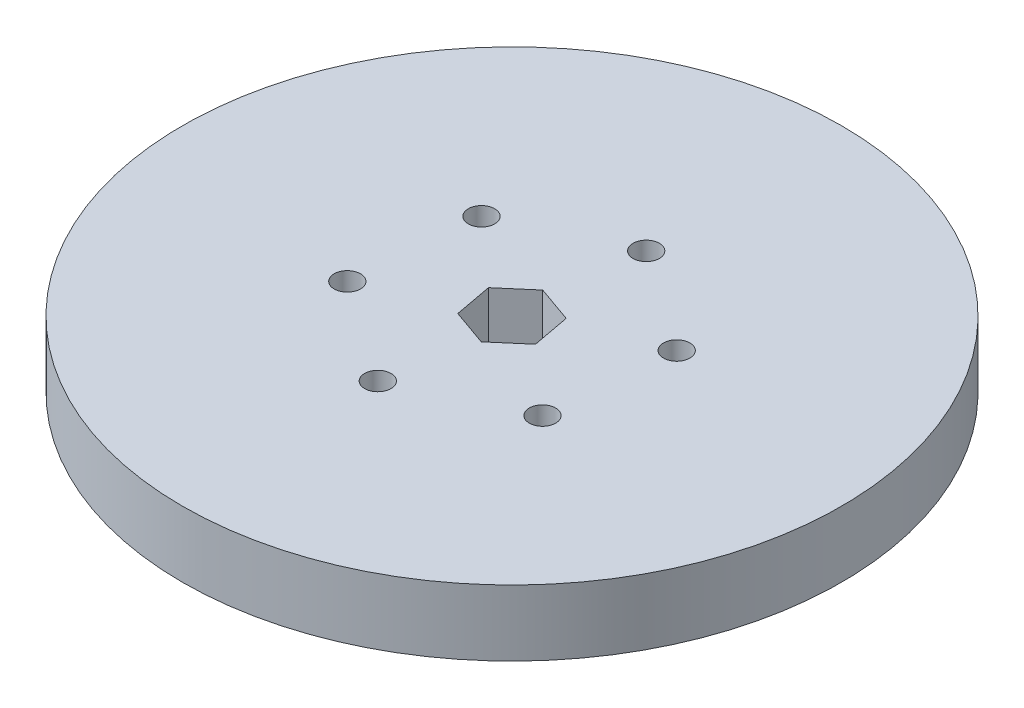
ISO-10303-21;
HEADER;
FILE_DESCRIPTION(('STEP AP214'),'2;1');
FILE_NAME('part.step','',(''),(''),'','','');
FILE_SCHEMA(('AUTOMOTIVE_DESIGN { 1 0 10303 214 1 1 1 1 }'));
ENDSEC;
DATA;
#1=APPLICATION_CONTEXT('core data for automotive mechanical design processes');
#2=APPLICATION_PROTOCOL_DEFINITION('international standard','automotive_design',2000,#1);
#3=PRODUCT_CONTEXT('',#1,'mechanical');
#4=PRODUCT('Part','Part','',(#3));
#5=PRODUCT_RELATED_PRODUCT_CATEGORY('part','',(#4));
#6=PRODUCT_DEFINITION_FORMATION('','',#4);
#7=PRODUCT_DEFINITION_CONTEXT('part definition',#1,'design');
#8=PRODUCT_DEFINITION('design','',#6,#7);
#9=PRODUCT_DEFINITION_SHAPE('','',#8);
#10=(LENGTH_UNIT() NAMED_UNIT(*) SI_UNIT(.MILLI.,.METRE.));
#11=(NAMED_UNIT(*) PLANE_ANGLE_UNIT() SI_UNIT($,.RADIAN.));
#12=(NAMED_UNIT(*) SI_UNIT($,.STERADIAN.) SOLID_ANGLE_UNIT());
#13=UNCERTAINTY_MEASURE_WITH_UNIT(LENGTH_MEASURE(1.E-05),#10,'distance_accuracy_value','');
#14=(GEOMETRIC_REPRESENTATION_CONTEXT(3) GLOBAL_UNCERTAINTY_ASSIGNED_CONTEXT((#13)) GLOBAL_UNIT_ASSIGNED_CONTEXT((#10,
#11,#12)) REPRESENTATION_CONTEXT('',''));
#15=CARTESIAN_POINT('',(0.,0.,0.));
#16=DIRECTION('',(0.,0.,1.));
#17=DIRECTION('',(1.,0.,0.));
#18=AXIS2_PLACEMENT_3D('',#15,#16,#17);
#19=CARTESIAN_POINT('',(0.,-12.7,0.));
#20=DIRECTION('',(0.,1.,0.));
#21=DIRECTION('',(0.,0.,1.));
#22=AXIS2_PLACEMENT_3D('',#19,#20,#21);
#23=CYLINDRICAL_SURFACE('',#22,63.5);
#24=CARTESIAN_POINT('',(0.,-12.7,0.));
#25=DIRECTION('',(0.,1.,0.));
#26=DIRECTION('',(0.,0.,1.));
#27=AXIS2_PLACEMENT_3D('',#24,#25,#26);
#28=CIRCLE('',#27,63.5);
#29=CARTESIAN_POINT('',(0.,-12.7,63.5));
#30=VERTEX_POINT('',#29);
#31=EDGE_CURVE('E11',#30,#30,#28,.T.);
#32=ORIENTED_EDGE('',*,*,#31,.T.);
#33=EDGE_LOOP('',(#32));
#34=FACE_BOUND('',#33,.T.);
#35=CARTESIAN_POINT('',(0.,0.,0.));
#36=DIRECTION('',(0.,1.,0.));
#37=DIRECTION('',(0.,0.,1.));
#38=AXIS2_PLACEMENT_3D('',#35,#36,#37);
#39=CIRCLE('',#38,63.5);
#40=CARTESIAN_POINT('',(0.,0.,63.5));
#41=VERTEX_POINT('',#40);
#42=EDGE_CURVE('E42',#41,#41,#39,.T.);
#43=ORIENTED_EDGE('',*,*,#42,.F.);
#44=EDGE_LOOP('',(#43));
#45=FACE_BOUND('',#44,.T.);
#46=ADVANCED_FACE('F39',(#34,#45),#23,.T.);
#47=CARTESIAN_POINT('',(0.,-12.7,0.));
#48=DIRECTION('',(0.,1.,0.));
#49=DIRECTION('',(0.,0.,1.));
#50=AXIS2_PLACEMENT_3D('',#47,#48,#49);
#51=PLANE('',#50);
#52=DIRECTION('',(-0.759346339530682,0.,0.65068666548605));
#53=VECTOR('',#52,1.);
#54=CARTESIAN_POINT('',(-1.36144400348039,-12.7,-7.27945372666937));
#55=LINE('',#54,#53);
#56=CARTESIAN_POINT('',(-1.36144400348039,-12.7,-7.27945372666937));
#57=VERTEX_POINT('',#56);
#58=CARTESIAN_POINT('',(-6.98491385470918,-12.7,-2.46068177049068));
#59=VERTEX_POINT('',#58);
#60=EDGE_CURVE('E101',#57,#59,#55,.T.);
#61=ORIENTED_EDGE('',*,*,#60,.T.);
#62=DIRECTION('',(0.183838012449366,0.,0.982956553047319));
#63=VECTOR('',#62,1.);
#64=CARTESIAN_POINT('',(-6.98491385470918,-12.7,-2.46068177049068));
#65=LINE('',#64,#63);
#66=CARTESIAN_POINT('',(-5.62346985122879,-12.7,4.81877195617869));
#67=VERTEX_POINT('',#66);
#68=EDGE_CURVE('E94',#59,#67,#65,.T.);
#69=ORIENTED_EDGE('',*,*,#68,.T.);
#70=DIRECTION('',(0.943184351980047,0.,0.332269887561269));
#71=VECTOR('',#70,1.);
#72=CARTESIAN_POINT('',(-5.62346985122879,-12.7,4.81877195617869));
#73=LINE('',#72,#71);
#74=CARTESIAN_POINT('',(1.36144400348039,-12.7,7.27945372666938));
#75=VERTEX_POINT('',#74);
#76=EDGE_CURVE('E104',#67,#75,#73,.T.);
#77=ORIENTED_EDGE('',*,*,#76,.T.);
#78=DIRECTION('',(0.759346339530681,0.,-0.65068666548605));
#79=VECTOR('',#78,1.);
#80=CARTESIAN_POINT('',(1.36144400348039,-12.7,7.27945372666938));
#81=LINE('',#80,#79);
#82=CARTESIAN_POINT('',(6.98491385470918,-12.7,2.46068177049068));
#83=VERTEX_POINT('',#82);
#84=EDGE_CURVE('E54',#75,#83,#81,.T.);
#85=ORIENTED_EDGE('',*,*,#84,.T.);
#86=DIRECTION('',(-0.183838012449366,0.,-0.982956553047319));
#87=VECTOR('',#86,1.);
#88=CARTESIAN_POINT('',(6.98491385470918,-12.7,2.46068177049068));
#89=LINE('',#88,#87);
#90=CARTESIAN_POINT('',(5.62346985122879,-12.7,-4.81877195617869));
#91=VERTEX_POINT('',#90);
#92=EDGE_CURVE('E123',#83,#91,#89,.T.);
#93=ORIENTED_EDGE('',*,*,#92,.T.);
#94=DIRECTION('',(-0.943184351980047,0.,-0.332269887561269));
#95=VECTOR('',#94,1.);
#96=CARTESIAN_POINT('',(5.62346985122879,-12.7,-4.81877195617869));
#97=LINE('',#96,#95);
#98=EDGE_CURVE('E127',#91,#57,#97,.T.);
#99=ORIENTED_EDGE('',*,*,#98,.T.);
#100=EDGE_LOOP('',(#61,#69,#77,#85,#93,#99));
#101=FACE_BOUND('',#100,.T.);
#102=CARTESIAN_POINT('',(-2.0723522882915,-12.7,23.7858935504474));
#103=DIRECTION('',(0.,1.,0.));
#104=DIRECTION('',(0.,0.,1.));
#105=AXIS2_PLACEMENT_3D('',#102,#103,#104);
#106=CIRCLE('',#105,2.54);
#107=CARTESIAN_POINT('',(-2.0723522882915,-12.7,26.3258935504474));
#108=VERTEX_POINT('',#107);
#109=EDGE_CURVE('E196',#108,#108,#106,.T.);
#110=ORIENTED_EDGE('',*,*,#109,.T.);
#111=EDGE_LOOP('',(#110));
#112=FACE_BOUND('',#111,.T.);
#113=CARTESIAN_POINT('',(19.5630119222539,-12.7,13.6876565024752));
#114=DIRECTION('',(0.,1.,0.));
#115=DIRECTION('',(0.,0.,1.));
#116=AXIS2_PLACEMENT_3D('',#113,#114,#115);
#117=CIRCLE('',#116,2.54000000000001);
#118=CARTESIAN_POINT('',(19.5630119222539,-12.7,16.2276565024752));
#119=VERTEX_POINT('',#118);
#120=EDGE_CURVE('E188',#119,#119,#117,.T.);
#121=ORIENTED_EDGE('',*,*,#120,.T.);
#122=EDGE_LOOP('',(#121));
#123=FACE_BOUND('',#122,.T.);
#124=CARTESIAN_POINT('',(-21.6353642105456,-12.7,10.0982370479724));
#125=DIRECTION('',(0.,1.,0.));
#126=DIRECTION('',(0.,0.,1.));
#127=AXIS2_PLACEMENT_3D('',#124,#125,#126);
#128=CIRCLE('',#127,2.54000000000001);
#129=CARTESIAN_POINT('',(-21.6353642105456,-12.7,12.6382370479724));
#130=VERTEX_POINT('',#129);
#131=EDGE_CURVE('E180',#130,#130,#128,.T.);
#132=ORIENTED_EDGE('',*,*,#131,.T.);
#133=EDGE_LOOP('',(#132));
#134=FACE_BOUND('',#133,.T.);
#135=CARTESIAN_POINT('',(-19.563011922254,-12.7,-13.687656502475));
#136=DIRECTION('',(0.,1.,0.));
#137=DIRECTION('',(0.,0.,1.));
#138=AXIS2_PLACEMENT_3D('',#135,#136,#137);
#139=CIRCLE('',#138,2.54);
#140=CARTESIAN_POINT('',(-19.563011922254,-12.7,-11.147656502475));
#141=VERTEX_POINT('',#140);
#142=EDGE_CURVE('E172',#141,#141,#139,.T.);
#143=ORIENTED_EDGE('',*,*,#142,.T.);
#144=EDGE_LOOP('',(#143));
#145=FACE_BOUND('',#144,.T.);
#146=CARTESIAN_POINT('',(2.07235228829167,-12.7,-23.7858935504473));
#147=DIRECTION('',(0.,1.,0.));
#148=DIRECTION('',(0.,0.,1.));
#149=AXIS2_PLACEMENT_3D('',#146,#147,#148);
#150=CIRCLE('',#149,2.54000000000001);
#151=CARTESIAN_POINT('',(2.07235228829167,-12.7,-21.2458935504473));
#152=VERTEX_POINT('',#151);
#153=EDGE_CURVE('E163',#152,#152,#150,.T.);
#154=ORIENTED_EDGE('',*,*,#153,.T.);
#155=EDGE_LOOP('',(#154));
#156=FACE_BOUND('',#155,.T.);
#157=CARTESIAN_POINT('',(21.6353642105457,-12.7,-10.0982370479722));
#158=DIRECTION('',(0.,1.,0.));
#159=DIRECTION('',(0.,0.,1.));
#160=AXIS2_PLACEMENT_3D('',#157,#158,#159);
#161=CIRCLE('',#160,2.54000000000001);
#162=CARTESIAN_POINT('',(21.6353642105457,-12.7,-7.55823704797221));
#163=VERTEX_POINT('',#162);
#164=EDGE_CURVE('E203',#163,#163,#161,.T.);
#165=ORIENTED_EDGE('',*,*,#164,.T.);
#166=EDGE_LOOP('',(#165));
#167=FACE_BOUND('',#166,.T.);
#168=ORIENTED_EDGE('',*,*,#31,.F.);
#169=EDGE_LOOP('',(#168));
#170=FACE_BOUND('',#169,.T.);
#171=ADVANCED_FACE('F109',(#101,#112,#123,#134,#145,#156,#167,#170),#51,.F.);
#172=CARTESIAN_POINT('',(0.,0.,0.));
#173=DIRECTION('',(0.,1.,0.));
#174=DIRECTION('',(0.,0.,1.));
#175=AXIS2_PLACEMENT_3D('',#172,#173,#174);
#176=PLANE('',#175);
#177=DIRECTION('',(0.183838012449366,0.,0.982956553047319));
#178=VECTOR('',#177,1.);
#179=CARTESIAN_POINT('',(-6.98491385470918,0.,-2.46068177049068));
#180=LINE('',#179,#178);
#181=CARTESIAN_POINT('',(-6.98491385470918,0.,-2.46068177049068));
#182=VERTEX_POINT('',#181);
#183=CARTESIAN_POINT('',(-5.62346985122879,0.,4.81877195617869));
#184=VERTEX_POINT('',#183);
#185=EDGE_CURVE('E62',#182,#184,#180,.T.);
#186=ORIENTED_EDGE('',*,*,#185,.F.);
#187=DIRECTION('',(-0.759346339530682,0.,0.65068666548605));
#188=VECTOR('',#187,1.);
#189=CARTESIAN_POINT('',(-1.36144400348039,0.,-7.27945372666937));
#190=LINE('',#189,#188);
#191=CARTESIAN_POINT('',(-1.36144400348039,0.,-7.27945372666937));
#192=VERTEX_POINT('',#191);
#193=EDGE_CURVE('E114',#192,#182,#190,.T.);
#194=ORIENTED_EDGE('',*,*,#193,.F.);
#195=DIRECTION('',(-0.943184351980047,0.,-0.332269887561269));
#196=VECTOR('',#195,1.);
#197=CARTESIAN_POINT('',(5.62346985122879,0.,-4.81877195617869));
#198=LINE('',#197,#196);
#199=CARTESIAN_POINT('',(5.62346985122879,0.,-4.81877195617869));
#200=VERTEX_POINT('',#199);
#201=EDGE_CURVE('E118',#200,#192,#198,.T.);
#202=ORIENTED_EDGE('',*,*,#201,.F.);
#203=DIRECTION('',(-0.183838012449366,0.,-0.982956553047319));
#204=VECTOR('',#203,1.);
#205=CARTESIAN_POINT('',(6.98491385470918,0.,2.46068177049068));
#206=LINE('',#205,#204);
#207=CARTESIAN_POINT('',(6.98491385470918,0.,2.46068177049068));
#208=VERTEX_POINT('',#207);
#209=EDGE_CURVE('E141',#208,#200,#206,.T.);
#210=ORIENTED_EDGE('',*,*,#209,.F.);
#211=DIRECTION('',(0.759346339530681,0.,-0.65068666548605));
#212=VECTOR('',#211,1.);
#213=CARTESIAN_POINT('',(1.36144400348039,0.,7.27945372666938));
#214=LINE('',#213,#212);
#215=CARTESIAN_POINT('',(1.36144400348039,0.,7.27945372666938));
#216=VERTEX_POINT('',#215);
#217=EDGE_CURVE('E137',#216,#208,#214,.T.);
#218=ORIENTED_EDGE('',*,*,#217,.F.);
#219=DIRECTION('',(0.943184351980047,0.,0.332269887561269));
#220=VECTOR('',#219,1.);
#221=CARTESIAN_POINT('',(-5.62346985122879,0.,4.81877195617869));
#222=LINE('',#221,#220);
#223=EDGE_CURVE('E134',#184,#216,#222,.T.);
#224=ORIENTED_EDGE('',*,*,#223,.F.);
#225=EDGE_LOOP('',(#186,#194,#202,#210,#218,#224));
#226=FACE_BOUND('',#225,.T.);
#227=CARTESIAN_POINT('',(-2.0723522882915,0.,23.7858935504474));
#228=DIRECTION('',(0.,1.,0.));
#229=DIRECTION('',(0.,0.,1.));
#230=AXIS2_PLACEMENT_3D('',#227,#228,#229);
#231=CIRCLE('',#230,2.54);
#232=CARTESIAN_POINT('',(-2.0723522882915,0.,26.3258935504474));
#233=VERTEX_POINT('',#232);
#234=EDGE_CURVE('E151',#233,#233,#231,.T.);
#235=ORIENTED_EDGE('',*,*,#234,.F.);
#236=EDGE_LOOP('',(#235));
#237=FACE_BOUND('',#236,.T.);
#238=CARTESIAN_POINT('',(19.5630119222539,0.,13.6876565024752));
#239=DIRECTION('',(0.,1.,0.));
#240=DIRECTION('',(0.,0.,1.));
#241=AXIS2_PLACEMENT_3D('',#238,#239,#240);
#242=CIRCLE('',#241,2.54000000000001);
#243=CARTESIAN_POINT('',(19.5630119222539,0.,16.2276565024752));
#244=VERTEX_POINT('',#243);
#245=EDGE_CURVE('E192',#244,#244,#242,.T.);
#246=ORIENTED_EDGE('',*,*,#245,.F.);
#247=EDGE_LOOP('',(#246));
#248=FACE_BOUND('',#247,.T.);
#249=CARTESIAN_POINT('',(-21.6353642105456,0.,10.0982370479724));
#250=DIRECTION('',(0.,1.,0.));
#251=DIRECTION('',(0.,0.,1.));
#252=AXIS2_PLACEMENT_3D('',#249,#250,#251);
#253=CIRCLE('',#252,2.54000000000001);
#254=CARTESIAN_POINT('',(-21.6353642105456,0.,12.6382370479724));
#255=VERTEX_POINT('',#254);
#256=EDGE_CURVE('E184',#255,#255,#253,.T.);
#257=ORIENTED_EDGE('',*,*,#256,.F.);
#258=EDGE_LOOP('',(#257));
#259=FACE_BOUND('',#258,.T.);
#260=CARTESIAN_POINT('',(-19.563011922254,0.,-13.687656502475));
#261=DIRECTION('',(0.,1.,0.));
#262=DIRECTION('',(0.,0.,1.));
#263=AXIS2_PLACEMENT_3D('',#260,#261,#262);
#264=CIRCLE('',#263,2.54);
#265=CARTESIAN_POINT('',(-19.563011922254,0.,-11.147656502475));
#266=VERTEX_POINT('',#265);
#267=EDGE_CURVE('E176',#266,#266,#264,.T.);
#268=ORIENTED_EDGE('',*,*,#267,.F.);
#269=EDGE_LOOP('',(#268));
#270=FACE_BOUND('',#269,.T.);
#271=CARTESIAN_POINT('',(2.07235228829167,0.,-23.7858935504473));
#272=DIRECTION('',(0.,1.,0.));
#273=DIRECTION('',(0.,0.,1.));
#274=AXIS2_PLACEMENT_3D('',#271,#272,#273);
#275=CIRCLE('',#274,2.54000000000001);
#276=CARTESIAN_POINT('',(2.07235228829167,0.,-21.2458935504473));
#277=VERTEX_POINT('',#276);
#278=EDGE_CURVE('E168',#277,#277,#275,.T.);
#279=ORIENTED_EDGE('',*,*,#278,.F.);
#280=EDGE_LOOP('',(#279));
#281=FACE_BOUND('',#280,.T.);
#282=CARTESIAN_POINT('',(21.6353642105457,0.,-10.0982370479722));
#283=DIRECTION('',(0.,1.,0.));
#284=DIRECTION('',(0.,0.,1.));
#285=AXIS2_PLACEMENT_3D('',#282,#283,#284);
#286=CIRCLE('',#285,2.54000000000001);
#287=CARTESIAN_POINT('',(21.6353642105457,0.,-7.55823704797221));
#288=VERTEX_POINT('',#287);
#289=EDGE_CURVE('E167',#288,#288,#286,.T.);
#290=ORIENTED_EDGE('',*,*,#289,.F.);
#291=EDGE_LOOP('',(#290));
#292=FACE_BOUND('',#291,.T.);
#293=ORIENTED_EDGE('',*,*,#42,.T.);
#294=EDGE_LOOP('',(#293));
#295=FACE_BOUND('',#294,.T.);
#296=ADVANCED_FACE('F213',(#226,#237,#248,#259,#270,#281,#292,#295),#176,.T.);
#297=CARTESIAN_POINT('',(21.6353642105457,-12.7,-10.0982370479722));
#298=DIRECTION('',(0.,1.,0.));
#299=DIRECTION('',(0.,0.,1.));
#300=AXIS2_PLACEMENT_3D('',#297,#298,#299);
#301=CYLINDRICAL_SURFACE('',#300,2.54000000000001);
#302=ORIENTED_EDGE('',*,*,#164,.F.);
#303=EDGE_LOOP('',(#302));
#304=FACE_BOUND('',#303,.T.);
#305=ORIENTED_EDGE('',*,*,#289,.T.);
#306=EDGE_LOOP('',(#305));
#307=FACE_BOUND('',#306,.T.);
#308=ADVANCED_FACE('F211',(#304,#307),#301,.F.);
#309=CARTESIAN_POINT('',(2.07235228829167,-12.7,-23.7858935504473));
#310=DIRECTION('',(0.,1.,0.));
#311=DIRECTION('',(0.,0.,1.));
#312=AXIS2_PLACEMENT_3D('',#309,#310,#311);
#313=CYLINDRICAL_SURFACE('',#312,2.54000000000001);
#314=ORIENTED_EDGE('',*,*,#153,.F.);
#315=EDGE_LOOP('',(#314));
#316=FACE_BOUND('',#315,.T.);
#317=ORIENTED_EDGE('',*,*,#278,.T.);
#318=EDGE_LOOP('',(#317));
#319=FACE_BOUND('',#318,.T.);
#320=ADVANCED_FACE('F234',(#316,#319),#313,.F.);
#321=CARTESIAN_POINT('',(-19.563011922254,-12.7,-13.687656502475));
#322=DIRECTION('',(0.,1.,0.));
#323=DIRECTION('',(0.,0.,1.));
#324=AXIS2_PLACEMENT_3D('',#321,#322,#323);
#325=CYLINDRICAL_SURFACE('',#324,2.54);
#326=ORIENTED_EDGE('',*,*,#142,.F.);
#327=EDGE_LOOP('',(#326));
#328=FACE_BOUND('',#327,.T.);
#329=ORIENTED_EDGE('',*,*,#267,.T.);
#330=EDGE_LOOP('',(#329));
#331=FACE_BOUND('',#330,.T.);
#332=ADVANCED_FACE('F247',(#328,#331),#325,.F.);
#333=CARTESIAN_POINT('',(-21.6353642105456,-12.7,10.0982370479724));
#334=DIRECTION('',(0.,1.,0.));
#335=DIRECTION('',(0.,0.,1.));
#336=AXIS2_PLACEMENT_3D('',#333,#334,#335);
#337=CYLINDRICAL_SURFACE('',#336,2.54000000000001);
#338=ORIENTED_EDGE('',*,*,#131,.F.);
#339=EDGE_LOOP('',(#338));
#340=FACE_BOUND('',#339,.T.);
#341=ORIENTED_EDGE('',*,*,#256,.T.);
#342=EDGE_LOOP('',(#341));
#343=FACE_BOUND('',#342,.T.);
#344=ADVANCED_FACE('F243',(#340,#343),#337,.F.);
#345=CARTESIAN_POINT('',(19.5630119222539,-12.7,13.6876565024752));
#346=DIRECTION('',(0.,1.,0.));
#347=DIRECTION('',(0.,0.,1.));
#348=AXIS2_PLACEMENT_3D('',#345,#346,#347);
#349=CYLINDRICAL_SURFACE('',#348,2.54000000000001);
#350=ORIENTED_EDGE('',*,*,#120,.F.);
#351=EDGE_LOOP('',(#350));
#352=FACE_BOUND('',#351,.T.);
#353=ORIENTED_EDGE('',*,*,#245,.T.);
#354=EDGE_LOOP('',(#353));
#355=FACE_BOUND('',#354,.T.);
#356=ADVANCED_FACE('F239',(#352,#355),#349,.F.);
#357=CARTESIAN_POINT('',(-2.0723522882915,-12.7,23.7858935504474));
#358=DIRECTION('',(0.,1.,0.));
#359=DIRECTION('',(0.,0.,1.));
#360=AXIS2_PLACEMENT_3D('',#357,#358,#359);
#361=CYLINDRICAL_SURFACE('',#360,2.54);
#362=ORIENTED_EDGE('',*,*,#109,.F.);
#363=EDGE_LOOP('',(#362));
#364=FACE_BOUND('',#363,.T.);
#365=ORIENTED_EDGE('',*,*,#234,.T.);
#366=EDGE_LOOP('',(#365));
#367=FACE_BOUND('',#366,.T.);
#368=ADVANCED_FACE('F236',(#364,#367),#361,.F.);
#369=CARTESIAN_POINT('',(-6.98491385470918,-12.7,-2.46068177049068));
#370=DIRECTION('',(-0.982956553047319,0.,0.183838012449366));
#371=DIRECTION('',(0.183838012449366,0.,0.982956553047319));
#372=AXIS2_PLACEMENT_3D('',#369,#370,#371);
#373=PLANE('',#372);
#374=ORIENTED_EDGE('',*,*,#185,.T.);
#375=DIRECTION('',(0.,1.,0.));
#376=VECTOR('',#375,1.);
#377=CARTESIAN_POINT('',(-5.62346985122879,-12.7,4.81877195617869));
#378=LINE('',#377,#376);
#379=EDGE_CURVE('E90',#67,#184,#378,.T.);
#380=ORIENTED_EDGE('',*,*,#379,.F.);
#381=ORIENTED_EDGE('',*,*,#68,.F.);
#382=DIRECTION('',(0.,1.,0.));
#383=VECTOR('',#382,1.);
#384=CARTESIAN_POINT('',(-6.98491385470918,-12.7,-2.46068177049068));
#385=LINE('',#384,#383);
#386=EDGE_CURVE('E148',#59,#182,#385,.T.);
#387=ORIENTED_EDGE('',*,*,#386,.T.);
#388=EDGE_LOOP('',(#374,#380,#381,#387));
#389=FACE_BOUND('',#388,.T.);
#390=ADVANCED_FACE('F92',(#389),#373,.F.);
#391=CARTESIAN_POINT('',(-1.36144400348039,-12.7,-7.27945372666937));
#392=DIRECTION('',(-0.65068666548605,0.,-0.759346339530682));
#393=DIRECTION('',(-0.759346339530682,0.,0.65068666548605));
#394=AXIS2_PLACEMENT_3D('',#391,#392,#393);
#395=PLANE('',#394);
#396=ORIENTED_EDGE('',*,*,#193,.T.);
#397=ORIENTED_EDGE('',*,*,#386,.F.);
#398=ORIENTED_EDGE('',*,*,#60,.F.);
#399=DIRECTION('',(0.,1.,0.));
#400=VECTOR('',#399,1.);
#401=CARTESIAN_POINT('',(-1.36144400348039,-12.7,-7.27945372666937));
#402=LINE('',#401,#400);
#403=EDGE_CURVE('E152',#57,#192,#402,.T.);
#404=ORIENTED_EDGE('',*,*,#403,.T.);
#405=EDGE_LOOP('',(#396,#397,#398,#404));
#406=FACE_BOUND('',#405,.T.);
#407=ADVANCED_FACE('F257',(#406),#395,.F.);
#408=CARTESIAN_POINT('',(5.62346985122879,-12.7,-4.81877195617869));
#409=DIRECTION('',(0.332269887561269,0.,-0.943184351980047));
#410=DIRECTION('',(-0.943184351980047,0.,-0.332269887561269));
#411=AXIS2_PLACEMENT_3D('',#408,#409,#410);
#412=PLANE('',#411);
#413=ORIENTED_EDGE('',*,*,#201,.T.);
#414=ORIENTED_EDGE('',*,*,#403,.F.);
#415=ORIENTED_EDGE('',*,*,#98,.F.);
#416=DIRECTION('',(0.,1.,0.));
#417=VECTOR('',#416,1.);
#418=CARTESIAN_POINT('',(5.62346985122879,-12.7,-4.81877195617869));
#419=LINE('',#418,#417);
#420=EDGE_CURVE('E155',#91,#200,#419,.T.);
#421=ORIENTED_EDGE('',*,*,#420,.T.);
#422=EDGE_LOOP('',(#413,#414,#415,#421));
#423=FACE_BOUND('',#422,.T.);
#424=ADVANCED_FACE('F266',(#423),#412,.F.);
#425=CARTESIAN_POINT('',(6.98491385470918,-12.7,2.46068177049068));
#426=DIRECTION('',(0.982956553047319,0.,-0.183838012449366));
#427=DIRECTION('',(-0.183838012449366,0.,-0.982956553047319));
#428=AXIS2_PLACEMENT_3D('',#425,#426,#427);
#429=PLANE('',#428);
#430=ORIENTED_EDGE('',*,*,#209,.T.);
#431=ORIENTED_EDGE('',*,*,#420,.F.);
#432=ORIENTED_EDGE('',*,*,#92,.F.);
#433=DIRECTION('',(0.,1.,0.));
#434=VECTOR('',#433,1.);
#435=CARTESIAN_POINT('',(6.98491385470918,-12.7,2.46068177049068));
#436=LINE('',#435,#434);
#437=EDGE_CURVE('E158',#83,#208,#436,.T.);
#438=ORIENTED_EDGE('',*,*,#437,.T.);
#439=EDGE_LOOP('',(#430,#431,#432,#438));
#440=FACE_BOUND('',#439,.T.);
#441=ADVANCED_FACE('F263',(#440),#429,.F.);
#442=CARTESIAN_POINT('',(1.36144400348039,-12.7,7.27945372666938));
#443=DIRECTION('',(0.65068666548605,0.,0.759346339530681));
#444=DIRECTION('',(0.759346339530682,0.,-0.65068666548605));
#445=AXIS2_PLACEMENT_3D('',#442,#443,#444);
#446=PLANE('',#445);
#447=ORIENTED_EDGE('',*,*,#217,.T.);
#448=ORIENTED_EDGE('',*,*,#437,.F.);
#449=ORIENTED_EDGE('',*,*,#84,.F.);
#450=DIRECTION('',(0.,1.,0.));
#451=VECTOR('',#450,1.);
#452=CARTESIAN_POINT('',(1.36144400348039,-12.7,7.27945372666938));
#453=LINE('',#452,#451);
#454=EDGE_CURVE('E100',#75,#216,#453,.T.);
#455=ORIENTED_EDGE('',*,*,#454,.T.);
#456=EDGE_LOOP('',(#447,#448,#449,#455));
#457=FACE_BOUND('',#456,.T.);
#458=ADVANCED_FACE('F260',(#457),#446,.F.);
#459=CARTESIAN_POINT('',(-5.62346985122879,-12.7,4.81877195617869));
#460=DIRECTION('',(-0.332269887561269,0.,0.943184351980047));
#461=DIRECTION('',(0.943184351980047,0.,0.33226988756127));
#462=AXIS2_PLACEMENT_3D('',#459,#460,#461);
#463=PLANE('',#462);
#464=ORIENTED_EDGE('',*,*,#223,.T.);
#465=ORIENTED_EDGE('',*,*,#454,.F.);
#466=ORIENTED_EDGE('',*,*,#76,.F.);
#467=ORIENTED_EDGE('',*,*,#379,.T.);
#468=EDGE_LOOP('',(#464,#465,#466,#467));
#469=FACE_BOUND('',#468,.T.);
#470=ADVANCED_FACE('F105',(#469),#463,.F.);
#471=CLOSED_SHELL('',(#46,#171,#296,#308,#320,#332,#344,#356,#368,#390,#407,#424,#441,#458,#470));
#472=MANIFOLD_SOLID_BREP('B2',#471);
#473=ADVANCED_BREP_SHAPE_REPRESENTATION('',(#18,#472),#14);
#474=SHAPE_DEFINITION_REPRESENTATION(#9,#473);
ENDSEC;
END-ISO-10303-21;
